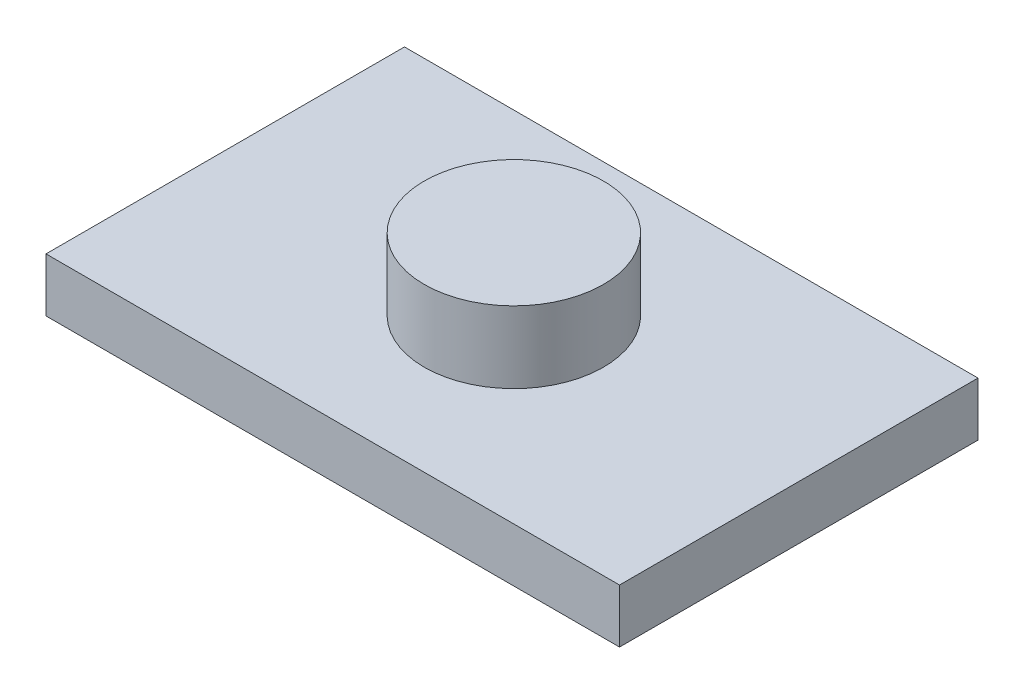
ISO-10303-21;
HEADER;
FILE_DESCRIPTION(('STEP AP214'),'2;1');
FILE_NAME('part.step','',(''),(''),'','','');
FILE_SCHEMA(('AUTOMOTIVE_DESIGN { 1 0 10303 214 1 1 1 1 }'));
ENDSEC;
DATA;
#1=APPLICATION_CONTEXT('core data for automotive mechanical design processes');
#2=APPLICATION_PROTOCOL_DEFINITION('international standard','automotive_design',2000,#1);
#3=PRODUCT_CONTEXT('',#1,'mechanical');
#4=PRODUCT('Part','Part','',(#3));
#5=PRODUCT_RELATED_PRODUCT_CATEGORY('part','',(#4));
#6=PRODUCT_DEFINITION_FORMATION('','',#4);
#7=PRODUCT_DEFINITION_CONTEXT('part definition',#1,'design');
#8=PRODUCT_DEFINITION('design','',#6,#7);
#9=PRODUCT_DEFINITION_SHAPE('','',#8);
#10=(LENGTH_UNIT() NAMED_UNIT(*) SI_UNIT(.MILLI.,.METRE.));
#11=(NAMED_UNIT(*) PLANE_ANGLE_UNIT() SI_UNIT($,.RADIAN.));
#12=(NAMED_UNIT(*) SI_UNIT($,.STERADIAN.) SOLID_ANGLE_UNIT());
#13=UNCERTAINTY_MEASURE_WITH_UNIT(LENGTH_MEASURE(1.E-05),#10,'distance_accuracy_value','');
#14=(GEOMETRIC_REPRESENTATION_CONTEXT(3) GLOBAL_UNCERTAINTY_ASSIGNED_CONTEXT((#13)) GLOBAL_UNIT_ASSIGNED_CONTEXT((#10,
#11,#12)) REPRESENTATION_CONTEXT('',''));
#15=CARTESIAN_POINT('',(0.,0.,0.));
#16=DIRECTION('',(0.,0.,1.));
#17=DIRECTION('',(1.,0.,0.));
#18=AXIS2_PLACEMENT_3D('',#15,#16,#17);
#19=CARTESIAN_POINT('',(1794.87058823529,9.525,-929.411764705883));
#20=DIRECTION('',(1.,0.,0.));
#21=DIRECTION('',(0.,0.,-1.));
#22=AXIS2_PLACEMENT_3D('',#19,#20,#21);
#23=PLANE('',#22);
#24=DIRECTION('',(0.,0.,1.));
#25=VECTOR('',#24,1.);
#26=CARTESIAN_POINT('',(1794.87058823529,0.,-929.411764705883));
#27=LINE('',#26,#25);
#28=CARTESIAN_POINT('',(1794.87058823529,0.,-929.411764705883));
#29=VERTEX_POINT('',#28);
#30=CARTESIAN_POINT('',(1794.87058823529,0.,-865.911764705883));
#31=VERTEX_POINT('',#30);
#32=EDGE_CURVE('E110',#29,#31,#27,.T.);
#33=ORIENTED_EDGE('',*,*,#32,.T.);
#34=DIRECTION('',(0.,-1.,0.));
#35=VECTOR('',#34,1.);
#36=CARTESIAN_POINT('',(1794.87058823529,9.525,-865.911764705883));
#37=LINE('',#36,#35);
#38=CARTESIAN_POINT('',(1794.87058823529,9.525,-865.911764705883));
#39=VERTEX_POINT('',#38);
#40=EDGE_CURVE('E42',#39,#31,#37,.T.);
#41=ORIENTED_EDGE('',*,*,#40,.F.);
#42=DIRECTION('',(0.,0.,1.));
#43=VECTOR('',#42,1.);
#44=CARTESIAN_POINT('',(1794.87058823529,9.525,-929.411764705883));
#45=LINE('',#44,#43);
#46=CARTESIAN_POINT('',(1794.87058823529,9.525,-929.411764705883));
#47=VERTEX_POINT('',#46);
#48=EDGE_CURVE('E95',#47,#39,#45,.T.);
#49=ORIENTED_EDGE('',*,*,#48,.F.);
#50=DIRECTION('',(0.,-1.,0.));
#51=VECTOR('',#50,1.);
#52=CARTESIAN_POINT('',(1794.87058823529,9.525,-929.411764705883));
#53=LINE('',#52,#51);
#54=EDGE_CURVE('E59',#47,#29,#53,.T.);
#55=ORIENTED_EDGE('',*,*,#54,.T.);
#56=EDGE_LOOP('',(#33,#41,#49,#55));
#57=FACE_BOUND('',#56,.T.);
#58=ADVANCED_FACE('F41',(#57),#23,.F.);
#59=CARTESIAN_POINT('',(1794.87058823529,9.525,-865.911764705883));
#60=DIRECTION('',(0.,0.,-1.));
#61=DIRECTION('',(-1.,0.,0.));
#62=AXIS2_PLACEMENT_3D('',#59,#60,#61);
#63=PLANE('',#62);
#64=DIRECTION('',(1.,0.,0.));
#65=VECTOR('',#64,1.);
#66=CARTESIAN_POINT('',(1794.87058823529,0.,-865.911764705883));
#67=LINE('',#66,#65);
#68=CARTESIAN_POINT('',(1896.47058823529,0.,-865.911764705883));
#69=VERTEX_POINT('',#68);
#70=EDGE_CURVE('E98',#31,#69,#67,.T.);
#71=ORIENTED_EDGE('',*,*,#70,.T.);
#72=DIRECTION('',(0.,-1.,0.));
#73=VECTOR('',#72,1.);
#74=CARTESIAN_POINT('',(1896.47058823529,9.525,-865.911764705883));
#75=LINE('',#74,#73);
#76=CARTESIAN_POINT('',(1896.47058823529,9.525,-865.911764705883));
#77=VERTEX_POINT('',#76);
#78=EDGE_CURVE('E96',#77,#69,#75,.T.);
#79=ORIENTED_EDGE('',*,*,#78,.F.);
#80=DIRECTION('',(1.,0.,0.));
#81=VECTOR('',#80,1.);
#82=CARTESIAN_POINT('',(1794.87058823529,9.525,-865.911764705883));
#83=LINE('',#82,#81);
#84=EDGE_CURVE('E83',#39,#77,#83,.T.);
#85=ORIENTED_EDGE('',*,*,#84,.F.);
#86=ORIENTED_EDGE('',*,*,#40,.T.);
#87=EDGE_LOOP('',(#71,#79,#85,#86));
#88=FACE_BOUND('',#87,.T.);
#89=ADVANCED_FACE('F100',(#88),#63,.F.);
#90=CARTESIAN_POINT('',(1896.47058823529,9.525,-929.411764705883));
#91=DIRECTION('',(1.,0.,0.));
#92=DIRECTION('',(0.,0.,-1.));
#93=AXIS2_PLACEMENT_3D('',#90,#91,#92);
#94=PLANE('',#93);
#95=DIRECTION('',(0.,0.,1.));
#96=VECTOR('',#95,1.);
#97=CARTESIAN_POINT('',(1896.47058823529,0.,-929.411764705883));
#98=LINE('',#97,#96);
#99=CARTESIAN_POINT('',(1896.47058823529,0.,-929.411764705883));
#100=VERTEX_POINT('',#99);
#101=EDGE_CURVE('E112',#100,#69,#98,.T.);
#102=ORIENTED_EDGE('',*,*,#101,.F.);
#103=DIRECTION('',(0.,-1.,0.));
#104=VECTOR('',#103,1.);
#105=CARTESIAN_POINT('',(1896.47058823529,9.525,-929.411764705883));
#106=LINE('',#105,#104);
#107=CARTESIAN_POINT('',(1896.47058823529,9.525,-929.411764705883));
#108=VERTEX_POINT('',#107);
#109=EDGE_CURVE('E75',#108,#100,#106,.T.);
#110=ORIENTED_EDGE('',*,*,#109,.F.);
#111=DIRECTION('',(0.,0.,1.));
#112=VECTOR('',#111,1.);
#113=CARTESIAN_POINT('',(1896.47058823529,9.525,-929.411764705883));
#114=LINE('',#113,#112);
#115=EDGE_CURVE('E93',#108,#77,#114,.T.);
#116=ORIENTED_EDGE('',*,*,#115,.T.);
#117=ORIENTED_EDGE('',*,*,#78,.T.);
#118=EDGE_LOOP('',(#102,#110,#116,#117));
#119=FACE_BOUND('',#118,.T.);
#120=ADVANCED_FACE('F101',(#119),#94,.T.);
#121=CARTESIAN_POINT('',(1794.87058823529,9.525,-929.411764705883));
#122=DIRECTION('',(0.,0.,-1.));
#123=DIRECTION('',(-1.,0.,0.));
#124=AXIS2_PLACEMENT_3D('',#121,#122,#123);
#125=PLANE('',#124);
#126=DIRECTION('',(1.,0.,0.));
#127=VECTOR('',#126,1.);
#128=CARTESIAN_POINT('',(1794.87058823529,0.,-929.411764705883));
#129=LINE('',#128,#127);
#130=EDGE_CURVE('E114',#29,#100,#129,.T.);
#131=ORIENTED_EDGE('',*,*,#130,.F.);
#132=ORIENTED_EDGE('',*,*,#54,.F.);
#133=DIRECTION('',(1.,0.,0.));
#134=VECTOR('',#133,1.);
#135=CARTESIAN_POINT('',(1794.87058823529,9.525,-929.411764705883));
#136=LINE('',#135,#134);
#137=EDGE_CURVE('E105',#47,#108,#136,.T.);
#138=ORIENTED_EDGE('',*,*,#137,.T.);
#139=ORIENTED_EDGE('',*,*,#109,.T.);
#140=EDGE_LOOP('',(#131,#132,#138,#139));
#141=FACE_BOUND('',#140,.T.);
#142=ADVANCED_FACE('F135',(#141),#125,.T.);
#143=CARTESIAN_POINT('',(0.,9.525,0.));
#144=DIRECTION('',(0.,1.,0.));
#145=DIRECTION('',(0.,0.,1.));
#146=AXIS2_PLACEMENT_3D('',#143,#144,#145);
#147=PLANE('',#146);
#148=CARTESIAN_POINT('',(1845.76507939927,9.525,-897.897992615827));
#149=DIRECTION('',(0.,1.,0.));
#150=DIRECTION('',(0.,0.,1.));
#151=AXIS2_PLACEMENT_3D('',#148,#149,#150);
#152=CIRCLE('',#151,15.8750000000002);
#153=CARTESIAN_POINT('',(1845.76507939927,9.525,-882.022992615826));
#154=VERTEX_POINT('',#153);
#155=EDGE_CURVE('E11',#154,#154,#152,.T.);
#156=ORIENTED_EDGE('',*,*,#155,.F.);
#157=EDGE_LOOP('',(#156));
#158=FACE_BOUND('',#157,.T.);
#159=ORIENTED_EDGE('',*,*,#48,.T.);
#160=ORIENTED_EDGE('',*,*,#84,.T.);
#161=ORIENTED_EDGE('',*,*,#115,.F.);
#162=ORIENTED_EDGE('',*,*,#137,.F.);
#163=EDGE_LOOP('',(#159,#160,#161,#162));
#164=FACE_BOUND('',#163,.T.);
#165=ADVANCED_FACE('F86',(#158,#164),#147,.T.);
#166=CARTESIAN_POINT('',(0.,0.,0.));
#167=DIRECTION('',(0.,1.,0.));
#168=DIRECTION('',(0.,0.,1.));
#169=AXIS2_PLACEMENT_3D('',#166,#167,#168);
#170=PLANE('',#169);
#171=ORIENTED_EDGE('',*,*,#32,.F.);
#172=ORIENTED_EDGE('',*,*,#130,.T.);
#173=ORIENTED_EDGE('',*,*,#101,.T.);
#174=ORIENTED_EDGE('',*,*,#70,.F.);
#175=EDGE_LOOP('',(#171,#172,#173,#174));
#176=FACE_BOUND('',#175,.T.);
#177=ADVANCED_FACE('F130',(#176),#170,.F.);
#178=CARTESIAN_POINT('',(1845.76507939927,22.225,-897.897992615827));
#179=DIRECTION('',(0.,-1.,0.));
#180=DIRECTION('',(0.,0.,-1.));
#181=AXIS2_PLACEMENT_3D('',#178,#179,#180);
#182=CYLINDRICAL_SURFACE('',#181,15.8750000000002);
#183=CARTESIAN_POINT('',(1845.76507939927,22.225,-897.897992615827));
#184=DIRECTION('',(0.,1.,0.));
#185=DIRECTION('',(0.,0.,1.));
#186=AXIS2_PLACEMENT_3D('',#183,#184,#185);
#187=CIRCLE('',#186,15.8750000000002);
#188=CARTESIAN_POINT('',(1845.76507939927,22.225,-882.022992615826));
#189=VERTEX_POINT('',#188);
#190=EDGE_CURVE('E108',#189,#189,#187,.T.);
#191=ORIENTED_EDGE('',*,*,#190,.F.);
#192=EDGE_LOOP('',(#191));
#193=FACE_BOUND('',#192,.T.);
#194=ORIENTED_EDGE('',*,*,#155,.T.);
#195=EDGE_LOOP('',(#194));
#196=FACE_BOUND('',#195,.T.);
#197=ADVANCED_FACE('F123',(#193,#196),#182,.T.);
#198=CARTESIAN_POINT('',(1845.76507939927,22.225,-897.897992615827));
#199=DIRECTION('',(0.,1.,0.));
#200=DIRECTION('',(0.,0.,1.));
#201=AXIS2_PLACEMENT_3D('',#198,#199,#200);
#202=PLANE('',#201);
#203=ORIENTED_EDGE('',*,*,#190,.T.);
#204=EDGE_LOOP('',(#203));
#205=FACE_BOUND('',#204,.T.);
#206=ADVANCED_FACE('F122',(#205),#202,.T.);
#207=CLOSED_SHELL('',(#58,#89,#120,#142,#165,#177,#197,#206));
#208=MANIFOLD_SOLID_BREP('B2',#207);
#209=ADVANCED_BREP_SHAPE_REPRESENTATION('',(#18,#208),#14);
#210=SHAPE_DEFINITION_REPRESENTATION(#9,#209);
ENDSEC;
END-ISO-10303-21;
